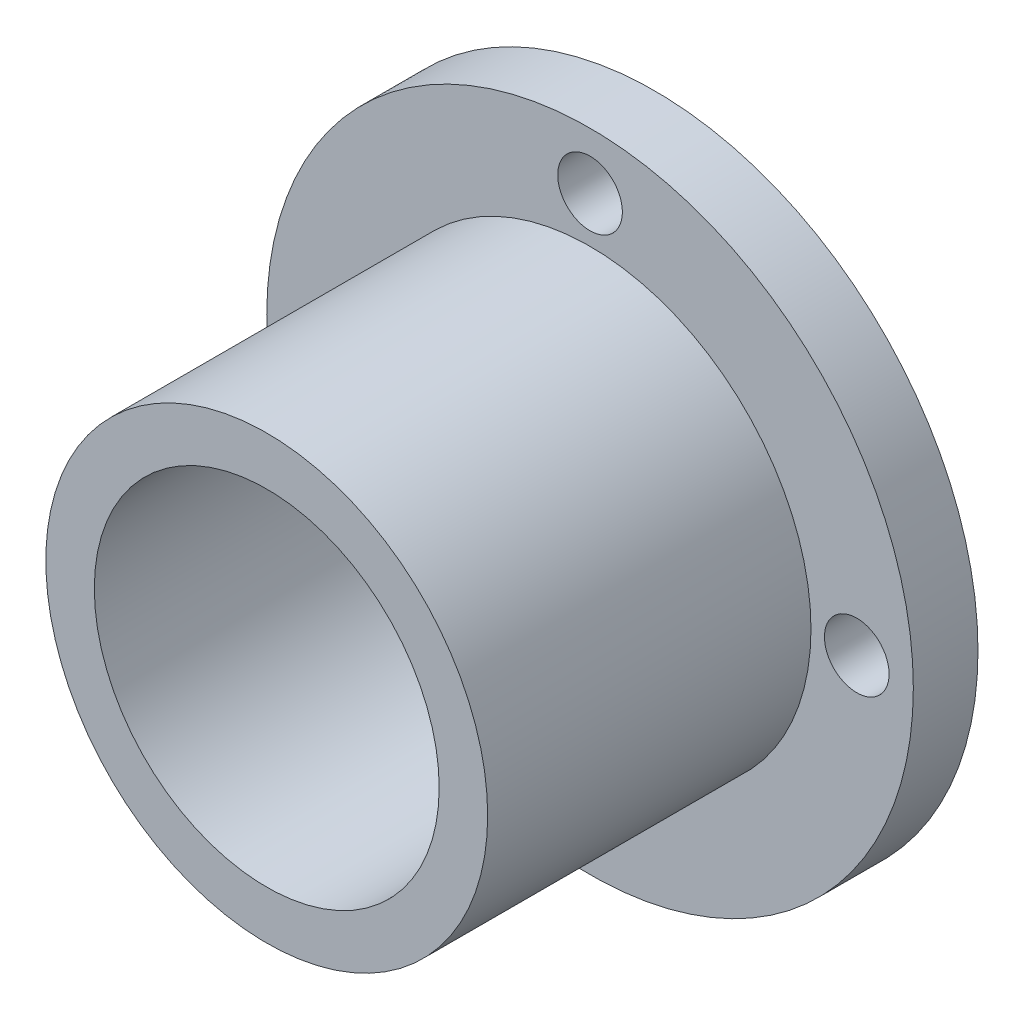
ISO-10303-21;
HEADER;
FILE_DESCRIPTION(('STEP AP214'),'2;1');
FILE_NAME('part.step','',(''),(''),'','','');
FILE_SCHEMA(('AUTOMOTIVE_DESIGN { 1 0 10303 214 1 1 1 1 }'));
ENDSEC;
DATA;
#1=APPLICATION_CONTEXT('core data for automotive mechanical design processes');
#2=APPLICATION_PROTOCOL_DEFINITION('international standard','automotive_design',2000,#1);
#3=PRODUCT_CONTEXT('',#1,'mechanical');
#4=PRODUCT('Part','Part','',(#3));
#5=PRODUCT_RELATED_PRODUCT_CATEGORY('part','',(#4));
#6=PRODUCT_DEFINITION_FORMATION('','',#4);
#7=PRODUCT_DEFINITION_CONTEXT('part definition',#1,'design');
#8=PRODUCT_DEFINITION('design','',#6,#7);
#9=PRODUCT_DEFINITION_SHAPE('','',#8);
#10=(LENGTH_UNIT() NAMED_UNIT(*) SI_UNIT(.MILLI.,.METRE.));
#11=(NAMED_UNIT(*) PLANE_ANGLE_UNIT() SI_UNIT($,.RADIAN.));
#12=(NAMED_UNIT(*) SI_UNIT($,.STERADIAN.) SOLID_ANGLE_UNIT());
#13=UNCERTAINTY_MEASURE_WITH_UNIT(LENGTH_MEASURE(1.E-05),#10,'distance_accuracy_value','');
#14=(GEOMETRIC_REPRESENTATION_CONTEXT(3) GLOBAL_UNCERTAINTY_ASSIGNED_CONTEXT((#13)) GLOBAL_UNIT_ASSIGNED_CONTEXT((#10,
#11,#12)) REPRESENTATION_CONTEXT('',''));
#15=CARTESIAN_POINT('',(0.,0.,0.));
#16=DIRECTION('',(0.,0.,1.));
#17=DIRECTION('',(1.,0.,0.));
#18=AXIS2_PLACEMENT_3D('',#15,#16,#17);
#19=CARTESIAN_POINT('',(0.,0.,20.));
#20=DIRECTION('',(0.,0.,1.));
#21=DIRECTION('',(1.,0.,0.));
#22=AXIS2_PLACEMENT_3D('',#19,#20,#21);
#23=PLANE('',#22);
#24=CARTESIAN_POINT('',(0.,0.,20.));
#25=DIRECTION('',(0.,0.,1.));
#26=DIRECTION('',(1.,0.,0.));
#27=AXIS2_PLACEMENT_3D('',#24,#25,#26);
#28=CIRCLE('',#27,13.668);
#29=CARTESIAN_POINT('',(13.668,0.,20.));
#30=VERTEX_POINT('',#29);
#31=EDGE_CURVE('E10',#30,#30,#28,.T.);
#32=ORIENTED_EDGE('',*,*,#31,.T.);
#33=EDGE_LOOP('',(#32));
#34=FACE_BOUND('',#33,.T.);
#35=CARTESIAN_POINT('',(0.,0.,20.));
#36=DIRECTION('',(0.,0.,1.));
#37=DIRECTION('',(1.,0.,0.));
#38=AXIS2_PLACEMENT_3D('',#35,#36,#37);
#39=CIRCLE('',#38,10.668);
#40=CARTESIAN_POINT('',(10.668,0.,20.));
#41=VERTEX_POINT('',#40);
#42=EDGE_CURVE('E38',#41,#41,#39,.T.);
#43=ORIENTED_EDGE('',*,*,#42,.F.);
#44=EDGE_LOOP('',(#43));
#45=FACE_BOUND('',#44,.T.);
#46=ADVANCED_FACE('F30',(#34,#45),#23,.T.);
#47=CARTESIAN_POINT('',(0.,0.,20.));
#48=DIRECTION('',(0.,0.,-1.));
#49=DIRECTION('',(-1.,0.,0.));
#50=AXIS2_PLACEMENT_3D('',#47,#48,#49);
#51=CYLINDRICAL_SURFACE('',#50,13.668);
#52=ORIENTED_EDGE('',*,*,#31,.F.);
#53=EDGE_LOOP('',(#52));
#54=FACE_BOUND('',#53,.T.);
#55=CARTESIAN_POINT('',(0.,0.,0.));
#56=DIRECTION('',(0.,0.,1.));
#57=DIRECTION('',(1.,0.,0.));
#58=AXIS2_PLACEMENT_3D('',#55,#56,#57);
#59=CIRCLE('',#58,13.668);
#60=CARTESIAN_POINT('',(13.668,0.,0.));
#61=VERTEX_POINT('',#60);
#62=EDGE_CURVE('E34',#61,#61,#59,.T.);
#63=ORIENTED_EDGE('',*,*,#62,.T.);
#64=EDGE_LOOP('',(#63));
#65=FACE_BOUND('',#64,.T.);
#66=ADVANCED_FACE('F32',(#54,#65),#51,.T.);
#67=CARTESIAN_POINT('',(0.,0.,20.));
#68=DIRECTION('',(0.,0.,-1.));
#69=DIRECTION('',(-1.,0.,0.));
#70=AXIS2_PLACEMENT_3D('',#67,#68,#69);
#71=CYLINDRICAL_SURFACE('',#70,10.668);
#72=ORIENTED_EDGE('',*,*,#42,.T.);
#73=EDGE_LOOP('',(#72));
#74=FACE_BOUND('',#73,.T.);
#75=CARTESIAN_POINT('',(0.,0.,0.));
#76=DIRECTION('',(0.,0.,1.));
#77=DIRECTION('',(1.,0.,0.));
#78=AXIS2_PLACEMENT_3D('',#75,#76,#77);
#79=CIRCLE('',#78,10.668);
#80=CARTESIAN_POINT('',(10.668,0.,0.));
#81=VERTEX_POINT('',#80);
#82=EDGE_CURVE('E42',#81,#81,#79,.T.);
#83=ORIENTED_EDGE('',*,*,#82,.F.);
#84=EDGE_LOOP('',(#83));
#85=FACE_BOUND('',#84,.T.);
#86=ADVANCED_FACE('F114',(#74,#85),#71,.F.);
#87=CARTESIAN_POINT('',(0.,0.,0.));
#88=DIRECTION('',(0.,0.,-1.));
#89=DIRECTION('',(-1.,0.,0.));
#90=AXIS2_PLACEMENT_3D('',#87,#88,#89);
#91=PLANE('',#90);
#92=ORIENTED_EDGE('',*,*,#82,.T.);
#93=EDGE_LOOP('',(#92));
#94=FACE_BOUND('',#93,.T.);
#95=ADVANCED_FACE('F93',(#94),#91,.F.);
#96=CARTESIAN_POINT('',(0.,0.,-4.));
#97=DIRECTION('',(0.,0.,1.));
#98=DIRECTION('',(1.,0.,0.));
#99=AXIS2_PLACEMENT_3D('',#96,#97,#98);
#100=CYLINDRICAL_SURFACE('',#99,20.);
#101=CARTESIAN_POINT('',(0.,0.,-4.));
#102=DIRECTION('',(0.,0.,-1.));
#103=DIRECTION('',(-1.,0.,0.));
#104=AXIS2_PLACEMENT_3D('',#101,#102,#103);
#105=CIRCLE('',#104,20.);
#106=CARTESIAN_POINT('',(-20.,0.,-4.));
#107=VERTEX_POINT('',#106);
#108=EDGE_CURVE('E50',#107,#107,#105,.T.);
#109=ORIENTED_EDGE('',*,*,#108,.F.);
#110=EDGE_LOOP('',(#109));
#111=FACE_BOUND('',#110,.T.);
#112=CARTESIAN_POINT('',(0.,0.,0.));
#113=DIRECTION('',(0.,0.,-1.));
#114=DIRECTION('',(-1.,0.,0.));
#115=AXIS2_PLACEMENT_3D('',#112,#113,#114);
#116=CIRCLE('',#115,20.);
#117=CARTESIAN_POINT('',(-20.,0.,0.));
#118=VERTEX_POINT('',#117);
#119=EDGE_CURVE('E47',#118,#118,#116,.T.);
#120=ORIENTED_EDGE('',*,*,#119,.T.);
#121=EDGE_LOOP('',(#120));
#122=FACE_BOUND('',#121,.T.);
#123=ADVANCED_FACE('F105',(#111,#122),#100,.T.);
#124=CARTESIAN_POINT('',(0.,0.,-4.));
#125=DIRECTION('',(0.,0.,-1.));
#126=DIRECTION('',(-1.,0.,0.));
#127=AXIS2_PLACEMENT_3D('',#124,#125,#126);
#128=PLANE('',#127);
#129=CARTESIAN_POINT('',(0.,16.5,-4.));
#130=DIRECTION('',(0.,0.,1.));
#131=DIRECTION('',(1.,0.,0.));
#132=AXIS2_PLACEMENT_3D('',#129,#130,#131);
#133=CIRCLE('',#132,2.);
#134=CARTESIAN_POINT('',(2.,16.5,-4.));
#135=VERTEX_POINT('',#134);
#136=EDGE_CURVE('E51',#135,#135,#133,.T.);
#137=ORIENTED_EDGE('',*,*,#136,.T.);
#138=EDGE_LOOP('',(#137));
#139=FACE_BOUND('',#138,.T.);
#140=CARTESIAN_POINT('',(16.5000000000005,4.65927204773777E-13,-4.));
#141=DIRECTION('',(0.,0.,1.));
#142=DIRECTION('',(1.,0.,0.));
#143=AXIS2_PLACEMENT_3D('',#140,#141,#142);
#144=CIRCLE('',#143,2.);
#145=CARTESIAN_POINT('',(18.5000000000005,4.65927204773777E-13,-4.));
#146=VERTEX_POINT('',#145);
#147=EDGE_CURVE('E69',#146,#146,#144,.T.);
#148=ORIENTED_EDGE('',*,*,#147,.T.);
#149=EDGE_LOOP('',(#148));
#150=FACE_BOUND('',#149,.T.);
#151=CARTESIAN_POINT('',(9.31854409547553E-13,-16.5,-4.));
#152=DIRECTION('',(0.,0.,1.));
#153=DIRECTION('',(1.,0.,0.));
#154=AXIS2_PLACEMENT_3D('',#151,#152,#153);
#155=CIRCLE('',#154,2.);
#156=CARTESIAN_POINT('',(2.00000000000093,-16.5,-4.));
#157=VERTEX_POINT('',#156);
#158=EDGE_CURVE('E63',#157,#157,#155,.T.);
#159=ORIENTED_EDGE('',*,*,#158,.T.);
#160=EDGE_LOOP('',(#159));
#161=FACE_BOUND('',#160,.T.);
#162=CARTESIAN_POINT('',(-16.4999999999995,-4.6794787199237E-13,-4.));
#163=DIRECTION('',(0.,0.,1.));
#164=DIRECTION('',(1.,0.,0.));
#165=AXIS2_PLACEMENT_3D('',#162,#163,#164);
#166=CIRCLE('',#165,2.);
#167=CARTESIAN_POINT('',(-14.4999999999995,-4.6794787199237E-13,-4.));
#168=VERTEX_POINT('',#167);
#169=EDGE_CURVE('E57',#168,#168,#166,.T.);
#170=ORIENTED_EDGE('',*,*,#169,.T.);
#171=EDGE_LOOP('',(#170));
#172=FACE_BOUND('',#171,.T.);
#173=ORIENTED_EDGE('',*,*,#108,.T.);
#174=EDGE_LOOP('',(#173));
#175=FACE_BOUND('',#174,.T.);
#176=ADVANCED_FACE('F78',(#139,#150,#161,#172,#175),#128,.T.);
#177=CARTESIAN_POINT('',(0.,16.5,0.));
#178=DIRECTION('',(0.,0.,1.));
#179=DIRECTION('',(1.,0.,0.));
#180=AXIS2_PLACEMENT_3D('',#177,#178,#179);
#181=CIRCLE('',#180,2.);
#182=CARTESIAN_POINT('',(2.,16.5,0.));
#183=VERTEX_POINT('',#182);
#184=EDGE_CURVE('E72',#183,#183,#181,.T.);
#185=ORIENTED_EDGE('',*,*,#184,.F.);
#186=EDGE_LOOP('',(#185));
#187=FACE_BOUND('',#186,.T.);
#188=CARTESIAN_POINT('',(16.5000000000005,4.65927204773777E-13,0.));
#189=DIRECTION('',(0.,0.,1.));
#190=DIRECTION('',(1.,0.,0.));
#191=AXIS2_PLACEMENT_3D('',#188,#189,#190);
#192=CIRCLE('',#191,2.);
#193=CARTESIAN_POINT('',(18.5000000000005,4.65927204773777E-13,0.));
#194=VERTEX_POINT('',#193);
#195=EDGE_CURVE('E66',#194,#194,#192,.T.);
#196=ORIENTED_EDGE('',*,*,#195,.F.);
#197=EDGE_LOOP('',(#196));
#198=FACE_BOUND('',#197,.T.);
#199=CARTESIAN_POINT('',(9.31854409547553E-13,-16.5,0.));
#200=DIRECTION('',(0.,0.,1.));
#201=DIRECTION('',(1.,0.,0.));
#202=AXIS2_PLACEMENT_3D('',#199,#200,#201);
#203=CIRCLE('',#202,2.);
#204=CARTESIAN_POINT('',(2.00000000000093,-16.5,0.));
#205=VERTEX_POINT('',#204);
#206=EDGE_CURVE('E60',#205,#205,#203,.T.);
#207=ORIENTED_EDGE('',*,*,#206,.F.);
#208=EDGE_LOOP('',(#207));
#209=FACE_BOUND('',#208,.T.);
#210=CARTESIAN_POINT('',(-16.4999999999995,-4.6794787199237E-13,0.));
#211=DIRECTION('',(0.,0.,1.));
#212=DIRECTION('',(1.,0.,0.));
#213=AXIS2_PLACEMENT_3D('',#210,#211,#212);
#214=CIRCLE('',#213,2.);
#215=CARTESIAN_POINT('',(-14.4999999999995,-4.6794787199237E-13,0.));
#216=VERTEX_POINT('',#215);
#217=EDGE_CURVE('E54',#216,#216,#214,.T.);
#218=ORIENTED_EDGE('',*,*,#217,.F.);
#219=EDGE_LOOP('',(#218));
#220=FACE_BOUND('',#219,.T.);
#221=ORIENTED_EDGE('',*,*,#62,.F.);
#222=EDGE_LOOP('',(#221));
#223=FACE_BOUND('',#222,.T.);
#224=ORIENTED_EDGE('',*,*,#119,.F.);
#225=EDGE_LOOP('',(#224));
#226=FACE_BOUND('',#225,.T.);
#227=ADVANCED_FACE('F88',(#187,#198,#209,#220,#223,#226),#91,.F.);
#228=CARTESIAN_POINT('',(-16.4999999999995,-4.6794787199237E-13,-4.));
#229=DIRECTION('',(0.,0.,1.));
#230=DIRECTION('',(1.,0.,0.));
#231=AXIS2_PLACEMENT_3D('',#228,#229,#230);
#232=CYLINDRICAL_SURFACE('',#231,2.);
#233=ORIENTED_EDGE('',*,*,#169,.F.);
#234=EDGE_LOOP('',(#233));
#235=FACE_BOUND('',#234,.T.);
#236=ORIENTED_EDGE('',*,*,#217,.T.);
#237=EDGE_LOOP('',(#236));
#238=FACE_BOUND('',#237,.T.);
#239=ADVANCED_FACE('F91',(#235,#238),#232,.F.);
#240=CARTESIAN_POINT('',(9.31854409547553E-13,-16.5,-4.));
#241=DIRECTION('',(0.,0.,1.));
#242=DIRECTION('',(1.,0.,0.));
#243=AXIS2_PLACEMENT_3D('',#240,#241,#242);
#244=CYLINDRICAL_SURFACE('',#243,2.);
#245=ORIENTED_EDGE('',*,*,#158,.F.);
#246=EDGE_LOOP('',(#245));
#247=FACE_BOUND('',#246,.T.);
#248=ORIENTED_EDGE('',*,*,#206,.T.);
#249=EDGE_LOOP('',(#248));
#250=FACE_BOUND('',#249,.T.);
#251=ADVANCED_FACE('F162',(#247,#250),#244,.F.);
#252=CARTESIAN_POINT('',(16.5000000000005,4.65927204773777E-13,-4.));
#253=DIRECTION('',(0.,0.,1.));
#254=DIRECTION('',(1.,0.,0.));
#255=AXIS2_PLACEMENT_3D('',#252,#253,#254);
#256=CYLINDRICAL_SURFACE('',#255,2.);
#257=ORIENTED_EDGE('',*,*,#147,.F.);
#258=EDGE_LOOP('',(#257));
#259=FACE_BOUND('',#258,.T.);
#260=ORIENTED_EDGE('',*,*,#195,.T.);
#261=EDGE_LOOP('',(#260));
#262=FACE_BOUND('',#261,.T.);
#263=ADVANCED_FACE('F84',(#259,#262),#256,.F.);
#264=CARTESIAN_POINT('',(0.,16.5,-4.));
#265=DIRECTION('',(0.,0.,1.));
#266=DIRECTION('',(1.,0.,0.));
#267=AXIS2_PLACEMENT_3D('',#264,#265,#266);
#268=CYLINDRICAL_SURFACE('',#267,2.);
#269=ORIENTED_EDGE('',*,*,#136,.F.);
#270=EDGE_LOOP('',(#269));
#271=FACE_BOUND('',#270,.T.);
#272=ORIENTED_EDGE('',*,*,#184,.T.);
#273=EDGE_LOOP('',(#272));
#274=FACE_BOUND('',#273,.T.);
#275=ADVANCED_FACE('F81',(#271,#274),#268,.F.);
#276=CLOSED_SHELL('',(#46,#66,#86,#95,#123,#176,#227,#239,#251,#263,#275));
#277=MANIFOLD_SOLID_BREP('B2',#276);
#278=ADVANCED_BREP_SHAPE_REPRESENTATION('',(#18,#277),#14);
#279=SHAPE_DEFINITION_REPRESENTATION(#9,#278);
ENDSEC;
END-ISO-10303-21;
